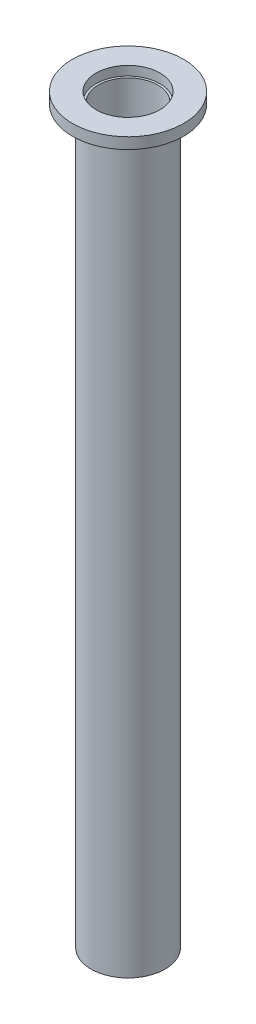
ISO-10303-21;
HEADER;
FILE_DESCRIPTION(('STEP AP214'),'2;1');
FILE_NAME('part.step','',(''),(''),'','','');
FILE_SCHEMA(('AUTOMOTIVE_DESIGN { 1 0 10303 214 1 1 1 1 }'));
ENDSEC;
DATA;
#1=APPLICATION_CONTEXT('core data for automotive mechanical design processes');
#2=APPLICATION_PROTOCOL_DEFINITION('international standard','automotive_design',2000,#1);
#3=PRODUCT_CONTEXT('',#1,'mechanical');
#4=PRODUCT('Part','Part','',(#3));
#5=PRODUCT_RELATED_PRODUCT_CATEGORY('part','',(#4));
#6=PRODUCT_DEFINITION_FORMATION('','',#4);
#7=PRODUCT_DEFINITION_CONTEXT('part definition',#1,'design');
#8=PRODUCT_DEFINITION('design','',#6,#7);
#9=PRODUCT_DEFINITION_SHAPE('','',#8);
#10=(LENGTH_UNIT() NAMED_UNIT(*) SI_UNIT(.MILLI.,.METRE.));
#11=(NAMED_UNIT(*) PLANE_ANGLE_UNIT() SI_UNIT($,.RADIAN.));
#12=(NAMED_UNIT(*) SI_UNIT($,.STERADIAN.) SOLID_ANGLE_UNIT());
#13=UNCERTAINTY_MEASURE_WITH_UNIT(LENGTH_MEASURE(1.E-05),#10,'distance_accuracy_value','');
#14=(GEOMETRIC_REPRESENTATION_CONTEXT(3) GLOBAL_UNCERTAINTY_ASSIGNED_CONTEXT((#13)) GLOBAL_UNIT_ASSIGNED_CONTEXT((#10,
#11,#12)) REPRESENTATION_CONTEXT('',''));
#15=CARTESIAN_POINT('',(0.,0.,0.));
#16=DIRECTION('',(0.,0.,1.));
#17=DIRECTION('',(1.,0.,0.));
#18=AXIS2_PLACEMENT_3D('',#15,#16,#17);
#19=CARTESIAN_POINT('',(15.,-78.,0.));
#20=DIRECTION('',(0.,1.,0.));
#21=DIRECTION('',(0.,0.,1.));
#22=AXIS2_PLACEMENT_3D('',#19,#20,#21);
#23=PLANE('',#22);
#24=CARTESIAN_POINT('',(0.,-78.,0.));
#25=DIRECTION('',(0.,-1.,0.));
#26=DIRECTION('',(0.,0.,-1.));
#27=AXIS2_PLACEMENT_3D('',#24,#25,#26);
#28=CIRCLE('',#27,8.6);
#29=CARTESIAN_POINT('',(0.,-78.,-8.6));
#30=VERTEX_POINT('',#29);
#31=EDGE_CURVE('E10',#30,#30,#28,.T.);
#32=ORIENTED_EDGE('',*,*,#31,.T.);
#33=EDGE_LOOP('',(#32));
#34=FACE_BOUND('',#33,.T.);
#35=CARTESIAN_POINT('',(0.,-78.,0.));
#36=DIRECTION('',(0.,-1.,0.));
#37=DIRECTION('',(0.,0.,-1.));
#38=AXIS2_PLACEMENT_3D('',#35,#36,#37);
#39=CIRCLE('',#38,15.);
#40=CARTESIAN_POINT('',(0.,-78.,-15.));
#41=VERTEX_POINT('',#40);
#42=EDGE_CURVE('E63',#41,#41,#39,.T.);
#43=ORIENTED_EDGE('',*,*,#42,.F.);
#44=EDGE_LOOP('',(#43));
#45=FACE_BOUND('',#44,.T.);
#46=ADVANCED_FACE('F35',(#34,#45),#23,.T.);
#47=CARTESIAN_POINT('',(0.,-500.,0.));
#48=DIRECTION('',(0.,-1.,0.));
#49=DIRECTION('',(0.,0.,-1.));
#50=AXIS2_PLACEMENT_3D('',#47,#48,#49);
#51=CYLINDRICAL_SURFACE('',#50,8.6);
#52=CARTESIAN_POINT('',(0.,-80.5,0.));
#53=DIRECTION('',(0.,-1.,0.));
#54=DIRECTION('',(0.,0.,-1.));
#55=AXIS2_PLACEMENT_3D('',#52,#53,#54);
#56=CIRCLE('',#55,8.6);
#57=CARTESIAN_POINT('',(0.,-80.5,-8.6));
#58=VERTEX_POINT('',#57);
#59=EDGE_CURVE('E41',#58,#58,#56,.T.);
#60=ORIENTED_EDGE('',*,*,#59,.T.);
#61=EDGE_LOOP('',(#60));
#62=FACE_BOUND('',#61,.T.);
#63=ORIENTED_EDGE('',*,*,#31,.F.);
#64=EDGE_LOOP('',(#63));
#65=FACE_BOUND('',#64,.T.);
#66=ADVANCED_FACE('F71',(#62,#65),#51,.F.);
#67=CARTESIAN_POINT('',(8.6,-80.5,0.));
#68=DIRECTION('',(0.,1.,0.));
#69=DIRECTION('',(0.,0.,1.));
#70=AXIS2_PLACEMENT_3D('',#67,#68,#69);
#71=PLANE('',#70);
#72=CARTESIAN_POINT('',(0.,-80.5,0.));
#73=DIRECTION('',(0.,-1.,0.));
#74=DIRECTION('',(0.,0.,-1.));
#75=AXIS2_PLACEMENT_3D('',#72,#73,#74);
#76=CIRCLE('',#75,8.);
#77=CARTESIAN_POINT('',(0.,-80.5,-8.));
#78=VERTEX_POINT('',#77);
#79=EDGE_CURVE('E45',#78,#78,#76,.T.);
#80=ORIENTED_EDGE('',*,*,#79,.T.);
#81=EDGE_LOOP('',(#80));
#82=FACE_BOUND('',#81,.T.);
#83=ORIENTED_EDGE('',*,*,#59,.F.);
#84=EDGE_LOOP('',(#83));
#85=FACE_BOUND('',#84,.T.);
#86=ADVANCED_FACE('F75',(#82,#85),#71,.T.);
#87=CARTESIAN_POINT('',(0.,-500.,0.));
#88=DIRECTION('',(0.,-1.,0.));
#89=DIRECTION('',(0.,0.,-1.));
#90=AXIS2_PLACEMENT_3D('',#87,#88,#89);
#91=CYLINDRICAL_SURFACE('',#90,8.);
#92=CARTESIAN_POINT('',(0.,-278.,0.));
#93=DIRECTION('',(0.,-1.,0.));
#94=DIRECTION('',(0.,0.,-1.));
#95=AXIS2_PLACEMENT_3D('',#92,#93,#94);
#96=CIRCLE('',#95,8.);
#97=CARTESIAN_POINT('',(0.,-278.,-8.));
#98=VERTEX_POINT('',#97);
#99=EDGE_CURVE('E49',#98,#98,#96,.T.);
#100=ORIENTED_EDGE('',*,*,#99,.T.);
#101=EDGE_LOOP('',(#100));
#102=FACE_BOUND('',#101,.T.);
#103=ORIENTED_EDGE('',*,*,#79,.F.);
#104=EDGE_LOOP('',(#103));
#105=FACE_BOUND('',#104,.T.);
#106=ADVANCED_FACE('F79',(#102,#105),#91,.F.);
#107=CARTESIAN_POINT('',(8.,-278.,0.));
#108=DIRECTION('',(0.,-1.,0.));
#109=DIRECTION('',(0.,0.,-1.));
#110=AXIS2_PLACEMENT_3D('',#107,#108,#109);
#111=PLANE('',#110);
#112=CARTESIAN_POINT('',(0.,-278.,0.));
#113=DIRECTION('',(0.,-1.,0.));
#114=DIRECTION('',(0.,0.,-1.));
#115=AXIS2_PLACEMENT_3D('',#112,#113,#114);
#116=CIRCLE('',#115,10.);
#117=CARTESIAN_POINT('',(0.,-278.,-10.));
#118=VERTEX_POINT('',#117);
#119=EDGE_CURVE('E54',#118,#118,#116,.T.);
#120=ORIENTED_EDGE('',*,*,#119,.T.);
#121=EDGE_LOOP('',(#120));
#122=FACE_BOUND('',#121,.T.);
#123=ORIENTED_EDGE('',*,*,#99,.F.);
#124=EDGE_LOOP('',(#123));
#125=FACE_BOUND('',#124,.T.);
#126=ADVANCED_FACE('F86',(#122,#125),#111,.T.);
#127=CARTESIAN_POINT('',(0.,-500.,0.));
#128=DIRECTION('',(0.,-1.,0.));
#129=DIRECTION('',(0.,0.,-1.));
#130=AXIS2_PLACEMENT_3D('',#127,#128,#129);
#131=CYLINDRICAL_SURFACE('',#130,10.);
#132=CARTESIAN_POINT('',(0.,-82.339745962,0.));
#133=DIRECTION('',(0.,-1.,0.));
#134=DIRECTION('',(0.,0.,-1.));
#135=AXIS2_PLACEMENT_3D('',#132,#133,#134);
#136=CIRCLE('',#135,10.);
#137=CARTESIAN_POINT('',(0.,-82.339745962,-10.));
#138=VERTEX_POINT('',#137);
#139=EDGE_CURVE('E57',#138,#138,#136,.T.);
#140=ORIENTED_EDGE('',*,*,#139,.T.);
#141=EDGE_LOOP('',(#140));
#142=FACE_BOUND('',#141,.T.);
#143=ORIENTED_EDGE('',*,*,#119,.F.);
#144=EDGE_LOOP('',(#143));
#145=FACE_BOUND('',#144,.T.);
#146=ADVANCED_FACE('F90',(#142,#145),#131,.T.);
#147=CARTESIAN_POINT('',(0.,-82.339745962,0.));
#148=DIRECTION('',(0.,1.,0.));
#149=DIRECTION('',(0.,0.,1.));
#150=AXIS2_PLACEMENT_3D('',#147,#148,#149);
#151=CONICAL_SURFACE('',#150,10.,1.30899693902479);
#152=CARTESIAN_POINT('',(0.,-81.,0.));
#153=DIRECTION('',(0.,-1.,0.));
#154=DIRECTION('',(0.,0.,-1.));
#155=AXIS2_PLACEMENT_3D('',#152,#153,#154);
#156=CIRCLE('',#155,15.);
#157=CARTESIAN_POINT('',(0.,-81.,-15.));
#158=VERTEX_POINT('',#157);
#159=EDGE_CURVE('E60',#158,#158,#156,.T.);
#160=ORIENTED_EDGE('',*,*,#159,.T.);
#161=EDGE_LOOP('',(#160));
#162=FACE_BOUND('',#161,.T.);
#163=ORIENTED_EDGE('',*,*,#139,.F.);
#164=EDGE_LOOP('',(#163));
#165=FACE_BOUND('',#164,.T.);
#166=ADVANCED_FACE('F94',(#162,#165),#151,.T.);
#167=CARTESIAN_POINT('',(0.,-500.,0.));
#168=DIRECTION('',(0.,-1.,0.));
#169=DIRECTION('',(0.,0.,-1.));
#170=AXIS2_PLACEMENT_3D('',#167,#168,#169);
#171=CYLINDRICAL_SURFACE('',#170,15.);
#172=ORIENTED_EDGE('',*,*,#42,.T.);
#173=EDGE_LOOP('',(#172));
#174=FACE_BOUND('',#173,.T.);
#175=ORIENTED_EDGE('',*,*,#159,.F.);
#176=EDGE_LOOP('',(#175));
#177=FACE_BOUND('',#176,.T.);
#178=ADVANCED_FACE('F67',(#174,#177),#171,.T.);
#179=CLOSED_SHELL('',(#46,#66,#86,#106,#126,#146,#166,#178));
#180=MANIFOLD_SOLID_BREP('B2',#179);
#181=ADVANCED_BREP_SHAPE_REPRESENTATION('',(#18,#180),#14);
#182=SHAPE_DEFINITION_REPRESENTATION(#9,#181);
ENDSEC;
END-ISO-10303-21;
